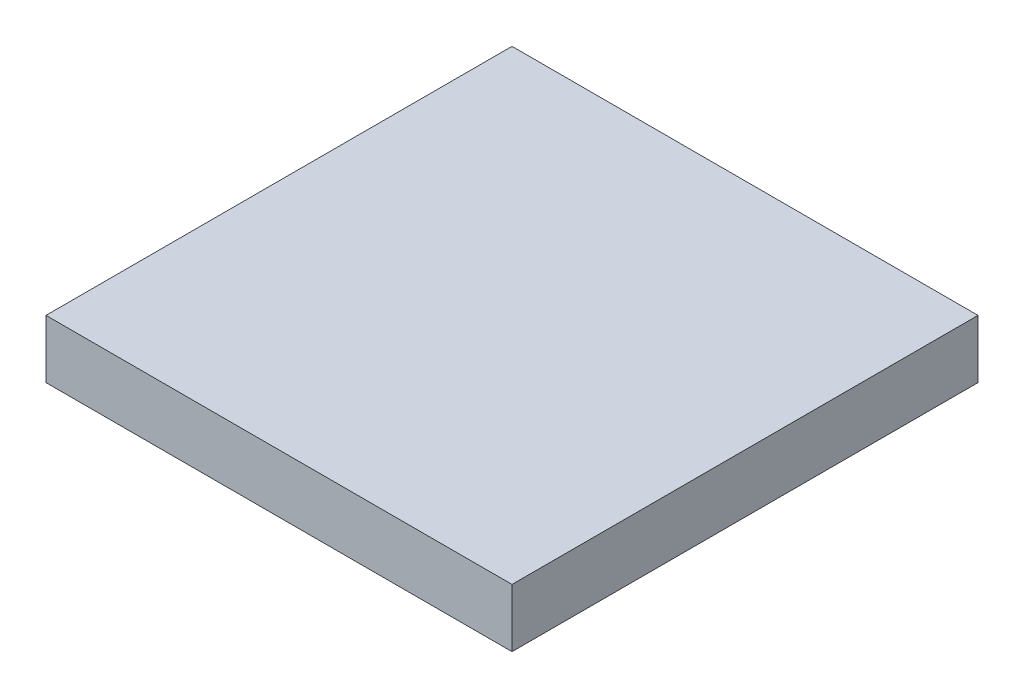
ISO-10303-21;
HEADER;
FILE_DESCRIPTION(('STEP AP214'),'2;1');
FILE_NAME('part.step','',(''),(''),'','','');
FILE_SCHEMA(('AUTOMOTIVE_DESIGN { 1 0 10303 214 1 1 1 1 }'));
ENDSEC;
DATA;
#1=APPLICATION_CONTEXT('core data for automotive mechanical design processes');
#2=APPLICATION_PROTOCOL_DEFINITION('international standard','automotive_design',2000,#1);
#3=PRODUCT_CONTEXT('',#1,'mechanical');
#4=PRODUCT('Part','Part','',(#3));
#5=PRODUCT_RELATED_PRODUCT_CATEGORY('part','',(#4));
#6=PRODUCT_DEFINITION_FORMATION('','',#4);
#7=PRODUCT_DEFINITION_CONTEXT('part definition',#1,'design');
#8=PRODUCT_DEFINITION('design','',#6,#7);
#9=PRODUCT_DEFINITION_SHAPE('','',#8);
#10=(LENGTH_UNIT() NAMED_UNIT(*) SI_UNIT(.MILLI.,.METRE.));
#11=(NAMED_UNIT(*) PLANE_ANGLE_UNIT() SI_UNIT($,.RADIAN.));
#12=(NAMED_UNIT(*) SI_UNIT($,.STERADIAN.) SOLID_ANGLE_UNIT());
#13=UNCERTAINTY_MEASURE_WITH_UNIT(LENGTH_MEASURE(1.E-05),#10,'distance_accuracy_value','');
#14=(GEOMETRIC_REPRESENTATION_CONTEXT(3) GLOBAL_UNCERTAINTY_ASSIGNED_CONTEXT((#13)) GLOBAL_UNIT_ASSIGNED_CONTEXT((#10,
#11,#12)) REPRESENTATION_CONTEXT('',''));
#15=CARTESIAN_POINT('',(0.,0.,0.));
#16=DIRECTION('',(0.,0.,1.));
#17=DIRECTION('',(1.,0.,0.));
#18=AXIS2_PLACEMENT_3D('',#15,#16,#17);
#19=CARTESIAN_POINT('',(-2.,0.5,-2.));
#20=DIRECTION('',(1.,0.,0.));
#21=DIRECTION('',(0.,0.,-1.));
#22=AXIS2_PLACEMENT_3D('',#19,#20,#21);
#23=PLANE('',#22);
#24=DIRECTION('',(0.,0.,1.));
#25=VECTOR('',#24,1.);
#26=CARTESIAN_POINT('',(-2.,0.,-2.));
#27=LINE('',#26,#25);
#28=CARTESIAN_POINT('',(-2.,0.,-2.));
#29=VERTEX_POINT('',#28);
#30=CARTESIAN_POINT('',(-2.,0.,2.));
#31=VERTEX_POINT('',#30);
#32=EDGE_CURVE('E102',#29,#31,#27,.T.);
#33=ORIENTED_EDGE('',*,*,#32,.T.);
#34=DIRECTION('',(0.,-1.,0.));
#35=VECTOR('',#34,1.);
#36=CARTESIAN_POINT('',(-2.,0.5,2.));
#37=LINE('',#36,#35);
#38=CARTESIAN_POINT('',(-2.,0.5,2.));
#39=VERTEX_POINT('',#38);
#40=EDGE_CURVE('E11',#39,#31,#37,.T.);
#41=ORIENTED_EDGE('',*,*,#40,.F.);
#42=DIRECTION('',(0.,0.,1.));
#43=VECTOR('',#42,1.);
#44=CARTESIAN_POINT('',(-2.,0.5,-2.));
#45=LINE('',#44,#43);
#46=CARTESIAN_POINT('',(-2.,0.5,-2.));
#47=VERTEX_POINT('',#46);
#48=EDGE_CURVE('E90',#47,#39,#45,.T.);
#49=ORIENTED_EDGE('',*,*,#48,.F.);
#50=DIRECTION('',(0.,-1.,0.));
#51=VECTOR('',#50,1.);
#52=CARTESIAN_POINT('',(-2.,0.5,-2.));
#53=LINE('',#52,#51);
#54=EDGE_CURVE('E98',#47,#29,#53,.T.);
#55=ORIENTED_EDGE('',*,*,#54,.T.);
#56=EDGE_LOOP('',(#33,#41,#49,#55));
#57=FACE_BOUND('',#56,.T.);
#58=ADVANCED_FACE('F39',(#57),#23,.F.);
#59=CARTESIAN_POINT('',(2.,0.5,2.));
#60=DIRECTION('',(0.,0.,-1.));
#61=DIRECTION('',(-1.,0.,0.));
#62=AXIS2_PLACEMENT_3D('',#59,#60,#61);
#63=PLANE('',#62);
#64=DIRECTION('',(1.,0.,0.));
#65=VECTOR('',#64,1.);
#66=CARTESIAN_POINT('',(2.,0.,2.));
#67=LINE('',#66,#65);
#68=CARTESIAN_POINT('',(2.,0.,2.));
#69=VERTEX_POINT('',#68);
#70=EDGE_CURVE('E94',#31,#69,#67,.T.);
#71=ORIENTED_EDGE('',*,*,#70,.T.);
#72=DIRECTION('',(0.,-1.,0.));
#73=VECTOR('',#72,1.);
#74=CARTESIAN_POINT('',(2.,0.5,2.));
#75=LINE('',#74,#73);
#76=CARTESIAN_POINT('',(2.,0.5,2.));
#77=VERTEX_POINT('',#76);
#78=EDGE_CURVE('E47',#77,#69,#75,.T.);
#79=ORIENTED_EDGE('',*,*,#78,.F.);
#80=DIRECTION('',(1.,0.,0.));
#81=VECTOR('',#80,1.);
#82=CARTESIAN_POINT('',(2.,0.5,2.));
#83=LINE('',#82,#81);
#84=EDGE_CURVE('E85',#39,#77,#83,.T.);
#85=ORIENTED_EDGE('',*,*,#84,.F.);
#86=ORIENTED_EDGE('',*,*,#40,.T.);
#87=EDGE_LOOP('',(#71,#79,#85,#86));
#88=FACE_BOUND('',#87,.T.);
#89=ADVANCED_FACE('F93',(#88),#63,.F.);
#90=CARTESIAN_POINT('',(2.,0.5,-2.));
#91=DIRECTION('',(-1.,0.,0.));
#92=DIRECTION('',(0.,0.,1.));
#93=AXIS2_PLACEMENT_3D('',#90,#91,#92);
#94=PLANE('',#93);
#95=DIRECTION('',(0.,0.,-1.));
#96=VECTOR('',#95,1.);
#97=CARTESIAN_POINT('',(2.,0.,-2.));
#98=LINE('',#97,#96);
#99=CARTESIAN_POINT('',(2.,0.,-2.));
#100=VERTEX_POINT('',#99);
#101=EDGE_CURVE('E72',#69,#100,#98,.T.);
#102=ORIENTED_EDGE('',*,*,#101,.T.);
#103=DIRECTION('',(0.,-1.,0.));
#104=VECTOR('',#103,1.);
#105=CARTESIAN_POINT('',(2.,0.5,-2.));
#106=LINE('',#105,#104);
#107=CARTESIAN_POINT('',(2.,0.5,-2.));
#108=VERTEX_POINT('',#107);
#109=EDGE_CURVE('E95',#108,#100,#106,.T.);
#110=ORIENTED_EDGE('',*,*,#109,.F.);
#111=DIRECTION('',(0.,0.,-1.));
#112=VECTOR('',#111,1.);
#113=CARTESIAN_POINT('',(2.,0.5,-2.));
#114=LINE('',#113,#112);
#115=EDGE_CURVE('E88',#77,#108,#114,.T.);
#116=ORIENTED_EDGE('',*,*,#115,.F.);
#117=ORIENTED_EDGE('',*,*,#78,.T.);
#118=EDGE_LOOP('',(#102,#110,#116,#117));
#119=FACE_BOUND('',#118,.T.);
#120=ADVANCED_FACE('F96',(#119),#94,.F.);
#121=CARTESIAN_POINT('',(2.,0.5,-2.));
#122=DIRECTION('',(0.,0.,1.));
#123=DIRECTION('',(1.,0.,0.));
#124=AXIS2_PLACEMENT_3D('',#121,#122,#123);
#125=PLANE('',#124);
#126=DIRECTION('',(-1.,0.,0.));
#127=VECTOR('',#126,1.);
#128=CARTESIAN_POINT('',(2.,0.,-2.));
#129=LINE('',#128,#127);
#130=EDGE_CURVE('E78',#100,#29,#129,.T.);
#131=ORIENTED_EDGE('',*,*,#130,.T.);
#132=ORIENTED_EDGE('',*,*,#54,.F.);
#133=DIRECTION('',(-1.,0.,0.));
#134=VECTOR('',#133,1.);
#135=CARTESIAN_POINT('',(2.,0.5,-2.));
#136=LINE('',#135,#134);
#137=EDGE_CURVE('E55',#108,#47,#136,.T.);
#138=ORIENTED_EDGE('',*,*,#137,.F.);
#139=ORIENTED_EDGE('',*,*,#109,.T.);
#140=EDGE_LOOP('',(#131,#132,#138,#139));
#141=FACE_BOUND('',#140,.T.);
#142=ADVANCED_FACE('F109',(#141),#125,.F.);
#143=CARTESIAN_POINT('',(0.,0.5,0.));
#144=DIRECTION('',(0.,-1.,0.));
#145=DIRECTION('',(0.,0.,-1.));
#146=AXIS2_PLACEMENT_3D('',#143,#144,#145);
#147=PLANE('',#146);
#148=ORIENTED_EDGE('',*,*,#48,.T.);
#149=ORIENTED_EDGE('',*,*,#84,.T.);
#150=ORIENTED_EDGE('',*,*,#115,.T.);
#151=ORIENTED_EDGE('',*,*,#137,.T.);
#152=EDGE_LOOP('',(#148,#149,#150,#151));
#153=FACE_BOUND('',#152,.T.);
#154=ADVANCED_FACE('F86',(#153),#147,.F.);
#155=CARTESIAN_POINT('',(0.,0.,0.));
#156=DIRECTION('',(0.,-1.,0.));
#157=DIRECTION('',(0.,0.,-1.));
#158=AXIS2_PLACEMENT_3D('',#155,#156,#157);
#159=PLANE('',#158);
#160=ORIENTED_EDGE('',*,*,#32,.F.);
#161=ORIENTED_EDGE('',*,*,#130,.F.);
#162=ORIENTED_EDGE('',*,*,#101,.F.);
#163=ORIENTED_EDGE('',*,*,#70,.F.);
#164=EDGE_LOOP('',(#160,#161,#162,#163));
#165=FACE_BOUND('',#164,.T.);
#166=ADVANCED_FACE('F112',(#165),#159,.T.);
#167=CLOSED_SHELL('',(#58,#89,#120,#142,#154,#166));
#168=MANIFOLD_SOLID_BREP('B2',#167);
#169=ADVANCED_BREP_SHAPE_REPRESENTATION('',(#18,#168),#14);
#170=SHAPE_DEFINITION_REPRESENTATION(#9,#169);
ENDSEC;
END-ISO-10303-21;
